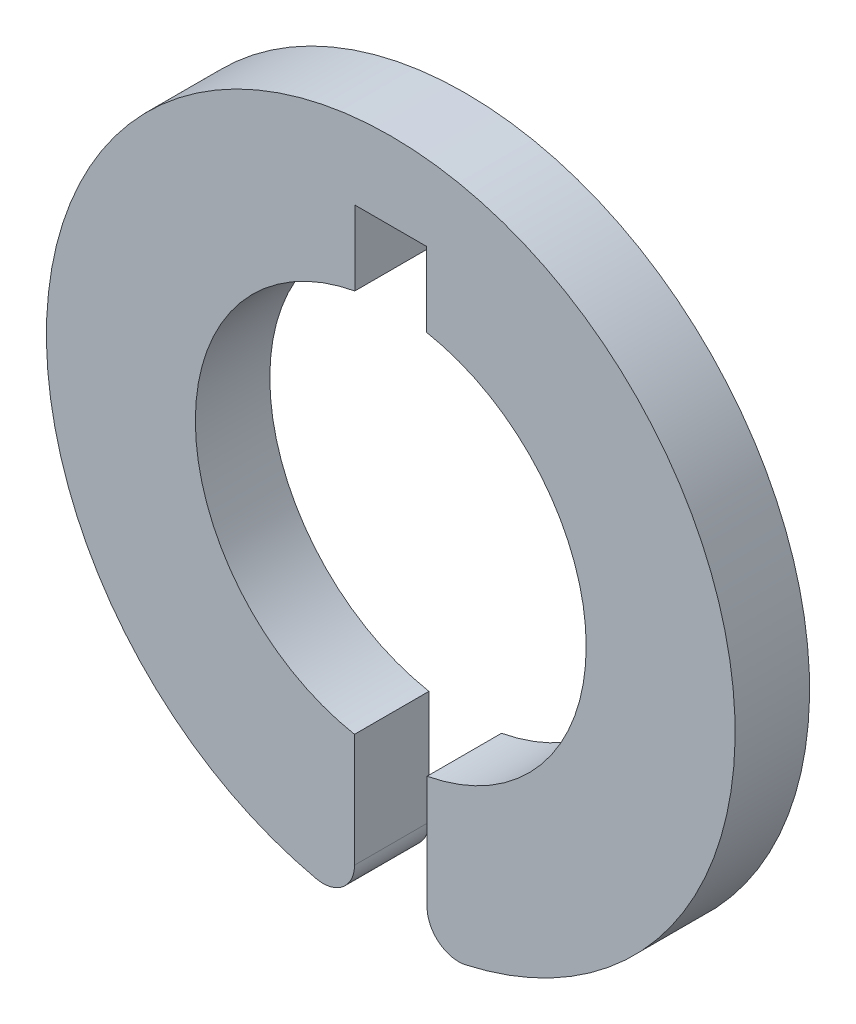
ISO-10303-21;
HEADER;
FILE_DESCRIPTION(('STEP AP214'),'2;1');
FILE_NAME('part.step','',(''),(''),'','','');
FILE_SCHEMA(('AUTOMOTIVE_DESIGN { 1 0 10303 214 1 1 1 1 }'));
ENDSEC;
DATA;
#1=APPLICATION_CONTEXT('core data for automotive mechanical design processes');
#2=APPLICATION_PROTOCOL_DEFINITION('international standard','automotive_design',2000,#1);
#3=PRODUCT_CONTEXT('',#1,'mechanical');
#4=PRODUCT('Part','Part','',(#3));
#5=PRODUCT_RELATED_PRODUCT_CATEGORY('part','',(#4));
#6=PRODUCT_DEFINITION_FORMATION('','',#4);
#7=PRODUCT_DEFINITION_CONTEXT('part definition',#1,'design');
#8=PRODUCT_DEFINITION('design','',#6,#7);
#9=PRODUCT_DEFINITION_SHAPE('','',#8);
#10=(LENGTH_UNIT() NAMED_UNIT(*) SI_UNIT(.MILLI.,.METRE.));
#11=(NAMED_UNIT(*) PLANE_ANGLE_UNIT() SI_UNIT($,.RADIAN.));
#12=(NAMED_UNIT(*) SI_UNIT($,.STERADIAN.) SOLID_ANGLE_UNIT());
#13=UNCERTAINTY_MEASURE_WITH_UNIT(LENGTH_MEASURE(1.E-05),#10,'distance_accuracy_value','');
#14=(GEOMETRIC_REPRESENTATION_CONTEXT(3) GLOBAL_UNCERTAINTY_ASSIGNED_CONTEXT((#13)) GLOBAL_UNIT_ASSIGNED_CONTEXT((#10,
#11,#12)) REPRESENTATION_CONTEXT('',''));
#15=CARTESIAN_POINT('',(0.,0.,0.));
#16=DIRECTION('',(0.,0.,1.));
#17=DIRECTION('',(1.,0.,0.));
#18=AXIS2_PLACEMENT_3D('',#15,#16,#17);
#19=CARTESIAN_POINT('',(0.,0.,3.));
#20=DIRECTION('',(0.,0.,-1.));
#21=DIRECTION('',(-1.,0.,0.));
#22=AXIS2_PLACEMENT_3D('',#19,#20,#21);
#23=CYLINDRICAL_SURFACE('',#22,7.874);
#24=CARTESIAN_POINT('',(0.,0.,0.));
#25=DIRECTION('',(0.,0.,-1.));
#26=DIRECTION('',(1.,0.,0.));
#27=AXIS2_PLACEMENT_3D('',#24,#25,#26);
#28=CIRCLE('',#27,7.874);
#29=CARTESIAN_POINT('',(1.4475,7.73980747499574,0.));
#30=VERTEX_POINT('',#29);
#31=CARTESIAN_POINT('',(1.4625,-7.73698712355139,0.));
#32=VERTEX_POINT('',#31);
#33=EDGE_CURVE('E140',#30,#32,#28,.T.);
#34=ORIENTED_EDGE('',*,*,#33,.T.);
#35=DIRECTION('',(0.,0.,-1.));
#36=VECTOR('',#35,1.);
#37=CARTESIAN_POINT('',(1.4625,-7.73698712355139,3.));
#38=LINE('',#37,#36);
#39=CARTESIAN_POINT('',(1.4625,-7.73698712355139,3.));
#40=VERTEX_POINT('',#39);
#41=EDGE_CURVE('E125',#40,#32,#38,.T.);
#42=ORIENTED_EDGE('',*,*,#41,.F.);
#43=CARTESIAN_POINT('',(0.,0.,3.));
#44=DIRECTION('',(0.,0.,-1.));
#45=DIRECTION('',(1.,0.,0.));
#46=AXIS2_PLACEMENT_3D('',#43,#44,#45);
#47=CIRCLE('',#46,7.874);
#48=CARTESIAN_POINT('',(1.4475,7.73980747499574,3.));
#49=VERTEX_POINT('',#48);
#50=EDGE_CURVE('E130',#49,#40,#47,.T.);
#51=ORIENTED_EDGE('',*,*,#50,.F.);
#52=DIRECTION('',(0.,0.,-1.));
#53=VECTOR('',#52,1.);
#54=CARTESIAN_POINT('',(1.4475,7.73980747499574,3.));
#55=LINE('',#54,#53);
#56=EDGE_CURVE('E185',#49,#30,#55,.T.);
#57=ORIENTED_EDGE('',*,*,#56,.T.);
#58=EDGE_LOOP('',(#34,#42,#51,#57));
#59=FACE_BOUND('',#58,.T.);
#60=ADVANCED_FACE('F45',(#59),#23,.F.);
#61=CARTESIAN_POINT('',(1.4625,-13.7967014083077,3.));
#62=DIRECTION('',(1.,0.,0.));
#63=DIRECTION('',(0.,0.,-1.));
#64=AXIS2_PLACEMENT_3D('',#61,#62,#63);
#65=PLANE('',#64);
#66=DIRECTION('',(0.,-1.,0.));
#67=VECTOR('',#66,1.);
#68=CARTESIAN_POINT('',(1.4625,-13.7967014083077,0.));
#69=LINE('',#68,#67);
#70=CARTESIAN_POINT('',(1.4625,-12.3042374712942,0.));
#71=VERTEX_POINT('',#70);
#72=EDGE_CURVE('E184',#32,#71,#69,.T.);
#73=ORIENTED_EDGE('',*,*,#72,.T.);
#74=DIRECTION('',(0.,0.,-1.));
#75=VECTOR('',#74,1.);
#76=CARTESIAN_POINT('',(1.4625,-12.3042374712942,3.));
#77=LINE('',#76,#75);
#78=CARTESIAN_POINT('',(1.4625,-12.3042374712942,3.));
#79=VERTEX_POINT('',#78);
#80=EDGE_CURVE('E62',#71,#79,#77,.F.);
#81=ORIENTED_EDGE('',*,*,#80,.T.);
#82=DIRECTION('',(0.,-1.,0.));
#83=VECTOR('',#82,1.);
#84=CARTESIAN_POINT('',(1.4625,-13.7967014083077,3.));
#85=LINE('',#84,#83);
#86=EDGE_CURVE('E118',#40,#79,#85,.T.);
#87=ORIENTED_EDGE('',*,*,#86,.F.);
#88=ORIENTED_EDGE('',*,*,#41,.T.);
#89=EDGE_LOOP('',(#73,#81,#87,#88));
#90=FACE_BOUND('',#89,.T.);
#91=ADVANCED_FACE('F124',(#90),#65,.F.);
#92=CARTESIAN_POINT('',(0.,0.,3.));
#93=DIRECTION('',(0.,0.,-1.));
#94=DIRECTION('',(-1.,0.,0.));
#95=AXIS2_PLACEMENT_3D('',#92,#93,#94);
#96=CYLINDRICAL_SURFACE('',#95,13.874);
#97=CARTESIAN_POINT('',(0.,0.,3.));
#98=DIRECTION('',(0.,0.,1.));
#99=DIRECTION('',(-1.,0.,0.));
#100=AXIS2_PLACEMENT_3D('',#97,#98,#99);
#101=CIRCLE('',#100,13.874);
#102=CARTESIAN_POINT('',(3.00783124404951,-13.5440329004075,3.));
#103=VERTEX_POINT('',#102);
#104=CARTESIAN_POINT('',(-3.00783124404951,-13.5440329004075,3.));
#105=VERTEX_POINT('',#104);
#106=EDGE_CURVE('E127',#103,#105,#101,.T.);
#107=ORIENTED_EDGE('',*,*,#106,.F.);
#108=DIRECTION('',(0.,0.,-1.));
#109=VECTOR('',#108,1.);
#110=CARTESIAN_POINT('',(3.00783124404951,-13.5440329004075,3.));
#111=LINE('',#110,#109);
#112=CARTESIAN_POINT('',(3.00783124404951,-13.5440329004075,0.));
#113=VERTEX_POINT('',#112);
#114=EDGE_CURVE('E142',#103,#113,#111,.T.);
#115=ORIENTED_EDGE('',*,*,#114,.T.);
#116=CARTESIAN_POINT('',(0.,0.,0.));
#117=DIRECTION('',(0.,0.,1.));
#118=DIRECTION('',(-1.,0.,0.));
#119=AXIS2_PLACEMENT_3D('',#116,#117,#118);
#120=CIRCLE('',#119,13.874);
#121=CARTESIAN_POINT('',(-3.00783124404951,-13.5440329004075,0.));
#122=VERTEX_POINT('',#121);
#123=EDGE_CURVE('E189',#113,#122,#120,.T.);
#124=ORIENTED_EDGE('',*,*,#123,.T.);
#125=DIRECTION('',(0.,0.,-1.));
#126=VECTOR('',#125,1.);
#127=CARTESIAN_POINT('',(-3.00783124404951,-13.5440329004075,3.));
#128=LINE('',#127,#126);
#129=EDGE_CURVE('E138',#122,#105,#128,.F.);
#130=ORIENTED_EDGE('',*,*,#129,.T.);
#131=EDGE_LOOP('',(#107,#115,#124,#130));
#132=FACE_BOUND('',#131,.T.);
#133=ADVANCED_FACE('F234',(#132),#96,.T.);
#134=CARTESIAN_POINT('',(-1.4625,-13.7967014083077,3.));
#135=DIRECTION('',(-1.,0.,0.));
#136=DIRECTION('',(0.,0.,1.));
#137=AXIS2_PLACEMENT_3D('',#134,#135,#136);
#138=PLANE('',#137);
#139=DIRECTION('',(0.,1.,0.));
#140=VECTOR('',#139,1.);
#141=CARTESIAN_POINT('',(-1.4625,-13.7967014083077,3.));
#142=LINE('',#141,#140);
#143=CARTESIAN_POINT('',(-1.4625,-12.3042374712942,3.));
#144=VERTEX_POINT('',#143);
#145=CARTESIAN_POINT('',(-1.4625,-7.73698712355139,3.));
#146=VERTEX_POINT('',#145);
#147=EDGE_CURVE('E170',#144,#146,#142,.T.);
#148=ORIENTED_EDGE('',*,*,#147,.F.);
#149=DIRECTION('',(0.,0.,-1.));
#150=VECTOR('',#149,1.);
#151=CARTESIAN_POINT('',(-1.4625,-12.3042374712942,3.));
#152=LINE('',#151,#150);
#153=CARTESIAN_POINT('',(-1.4625,-12.3042374712942,0.));
#154=VERTEX_POINT('',#153);
#155=EDGE_CURVE('E12',#144,#154,#152,.T.);
#156=ORIENTED_EDGE('',*,*,#155,.T.);
#157=DIRECTION('',(0.,1.,0.));
#158=VECTOR('',#157,1.);
#159=CARTESIAN_POINT('',(-1.4625,-13.7967014083077,0.));
#160=LINE('',#159,#158);
#161=CARTESIAN_POINT('',(-1.4625,-7.73698712355139,0.));
#162=VERTEX_POINT('',#161);
#163=EDGE_CURVE('E188',#154,#162,#160,.T.);
#164=ORIENTED_EDGE('',*,*,#163,.T.);
#165=DIRECTION('',(0.,0.,-1.));
#166=VECTOR('',#165,1.);
#167=CARTESIAN_POINT('',(-1.4625,-7.73698712355139,3.));
#168=LINE('',#167,#166);
#169=EDGE_CURVE('E137',#146,#162,#168,.T.);
#170=ORIENTED_EDGE('',*,*,#169,.F.);
#171=EDGE_LOOP('',(#148,#156,#164,#170));
#172=FACE_BOUND('',#171,.T.);
#173=ADVANCED_FACE('F237',(#172),#138,.F.);
#174=CARTESIAN_POINT('',(0.,0.,3.));
#175=DIRECTION('',(0.,0.,-1.));
#176=DIRECTION('',(-1.,0.,0.));
#177=AXIS2_PLACEMENT_3D('',#174,#175,#176);
#178=CYLINDRICAL_SURFACE('',#177,7.874);
#179=CARTESIAN_POINT('',(0.,0.,0.));
#180=DIRECTION('',(0.,0.,-1.));
#181=DIRECTION('',(1.,0.,0.));
#182=AXIS2_PLACEMENT_3D('',#179,#180,#181);
#183=CIRCLE('',#182,7.874);
#184=CARTESIAN_POINT('',(-1.4475,7.73980747499574,0.));
#185=VERTEX_POINT('',#184);
#186=EDGE_CURVE('E194',#162,#185,#183,.T.);
#187=ORIENTED_EDGE('',*,*,#186,.T.);
#188=DIRECTION('',(0.,0.,-1.));
#189=VECTOR('',#188,1.);
#190=CARTESIAN_POINT('',(-1.4475,7.73980747499574,3.));
#191=LINE('',#190,#189);
#192=CARTESIAN_POINT('',(-1.4475,7.73980747499574,3.));
#193=VERTEX_POINT('',#192);
#194=EDGE_CURVE('E144',#193,#185,#191,.T.);
#195=ORIENTED_EDGE('',*,*,#194,.F.);
#196=CARTESIAN_POINT('',(0.,0.,3.));
#197=DIRECTION('',(0.,0.,-1.));
#198=DIRECTION('',(1.,0.,0.));
#199=AXIS2_PLACEMENT_3D('',#196,#197,#198);
#200=CIRCLE('',#199,7.874);
#201=EDGE_CURVE('E166',#146,#193,#200,.T.);
#202=ORIENTED_EDGE('',*,*,#201,.F.);
#203=ORIENTED_EDGE('',*,*,#169,.T.);
#204=EDGE_LOOP('',(#187,#195,#202,#203));
#205=FACE_BOUND('',#204,.T.);
#206=ADVANCED_FACE('F236',(#205),#178,.F.);
#207=CARTESIAN_POINT('',(-1.4475,10.7398074749957,3.));
#208=DIRECTION('',(-1.,0.,0.));
#209=DIRECTION('',(0.,-1.,0.));
#210=AXIS2_PLACEMENT_3D('',#207,#208,#209);
#211=PLANE('',#210);
#212=DIRECTION('',(0.,1.,0.));
#213=VECTOR('',#212,1.);
#214=CARTESIAN_POINT('',(-1.4475,10.7398074749957,0.));
#215=LINE('',#214,#213);
#216=CARTESIAN_POINT('',(-1.4475,10.7398074749957,0.));
#217=VERTEX_POINT('',#216);
#218=EDGE_CURVE('E195',#185,#217,#215,.T.);
#219=ORIENTED_EDGE('',*,*,#218,.T.);
#220=DIRECTION('',(0.,0.,-1.));
#221=VECTOR('',#220,1.);
#222=CARTESIAN_POINT('',(-1.4475,10.7398074749957,3.));
#223=LINE('',#222,#221);
#224=CARTESIAN_POINT('',(-1.4475,10.7398074749957,3.));
#225=VERTEX_POINT('',#224);
#226=EDGE_CURVE('E205',#225,#217,#223,.T.);
#227=ORIENTED_EDGE('',*,*,#226,.F.);
#228=DIRECTION('',(0.,1.,0.));
#229=VECTOR('',#228,1.);
#230=CARTESIAN_POINT('',(-1.4475,10.7398074749957,3.));
#231=LINE('',#230,#229);
#232=EDGE_CURVE('E175',#193,#225,#231,.T.);
#233=ORIENTED_EDGE('',*,*,#232,.F.);
#234=ORIENTED_EDGE('',*,*,#194,.T.);
#235=EDGE_LOOP('',(#219,#227,#233,#234));
#236=FACE_BOUND('',#235,.T.);
#237=ADVANCED_FACE('F207',(#236),#211,.F.);
#238=CARTESIAN_POINT('',(-1.4475,10.7398074749957,3.));
#239=DIRECTION('',(0.,1.,0.));
#240=DIRECTION('',(-1.,0.,0.));
#241=AXIS2_PLACEMENT_3D('',#238,#239,#240);
#242=PLANE('',#241);
#243=DIRECTION('',(1.,0.,0.));
#244=VECTOR('',#243,1.);
#245=CARTESIAN_POINT('',(-1.4475,10.7398074749957,0.));
#246=LINE('',#245,#244);
#247=CARTESIAN_POINT('',(1.4475,10.7398074749957,0.));
#248=VERTEX_POINT('',#247);
#249=EDGE_CURVE('E192',#217,#248,#246,.T.);
#250=ORIENTED_EDGE('',*,*,#249,.T.);
#251=DIRECTION('',(0.,0.,-1.));
#252=VECTOR('',#251,1.);
#253=CARTESIAN_POINT('',(1.4475,10.7398074749957,3.));
#254=LINE('',#253,#252);
#255=CARTESIAN_POINT('',(1.4475,10.7398074749957,3.));
#256=VERTEX_POINT('',#255);
#257=EDGE_CURVE('E200',#256,#248,#254,.T.);
#258=ORIENTED_EDGE('',*,*,#257,.F.);
#259=DIRECTION('',(1.,0.,0.));
#260=VECTOR('',#259,1.);
#261=CARTESIAN_POINT('',(-1.4475,10.7398074749957,3.));
#262=LINE('',#261,#260);
#263=EDGE_CURVE('E179',#225,#256,#262,.T.);
#264=ORIENTED_EDGE('',*,*,#263,.F.);
#265=ORIENTED_EDGE('',*,*,#226,.T.);
#266=EDGE_LOOP('',(#250,#258,#264,#265));
#267=FACE_BOUND('',#266,.T.);
#268=ADVANCED_FACE('F225',(#267),#242,.F.);
#269=CARTESIAN_POINT('',(1.4475,10.7398074749957,3.));
#270=DIRECTION('',(1.,0.,0.));
#271=DIRECTION('',(0.,1.,0.));
#272=AXIS2_PLACEMENT_3D('',#269,#270,#271);
#273=PLANE('',#272);
#274=DIRECTION('',(0.,-1.,0.));
#275=VECTOR('',#274,1.);
#276=CARTESIAN_POINT('',(1.4475,10.7398074749957,0.));
#277=LINE('',#276,#275);
#278=EDGE_CURVE('E139',#248,#30,#277,.T.);
#279=ORIENTED_EDGE('',*,*,#278,.T.);
#280=ORIENTED_EDGE('',*,*,#56,.F.);
#281=DIRECTION('',(0.,-1.,0.));
#282=VECTOR('',#281,1.);
#283=CARTESIAN_POINT('',(1.4475,10.7398074749957,3.));
#284=LINE('',#283,#282);
#285=EDGE_CURVE('E131',#256,#49,#284,.T.);
#286=ORIENTED_EDGE('',*,*,#285,.F.);
#287=ORIENTED_EDGE('',*,*,#257,.T.);
#288=EDGE_LOOP('',(#279,#280,#286,#287));
#289=FACE_BOUND('',#288,.T.);
#290=ADVANCED_FACE('F223',(#289),#273,.F.);
#291=CARTESIAN_POINT('',(0.,0.,3.));
#292=DIRECTION('',(0.,0.,1.));
#293=DIRECTION('',(1.,0.,0.));
#294=AXIS2_PLACEMENT_3D('',#291,#292,#293);
#295=PLANE('',#294);
#296=ORIENTED_EDGE('',*,*,#86,.T.);
#297=CARTESIAN_POINT('',(2.7325,-12.3042374712942,3.));
#298=DIRECTION('',(0.,0.,1.));
#299=DIRECTION('',(1.,0.,0.));
#300=AXIS2_PLACEMENT_3D('',#297,#298,#299);
#301=CIRCLE('',#300,1.27);
#302=EDGE_CURVE('E49',#79,#103,#301,.T.);
#303=ORIENTED_EDGE('',*,*,#302,.T.);
#304=ORIENTED_EDGE('',*,*,#106,.T.);
#305=CARTESIAN_POINT('',(-2.7325,-12.3042374712942,3.));
#306=DIRECTION('',(0.,0.,1.));
#307=DIRECTION('',(1.,0.,0.));
#308=AXIS2_PLACEMENT_3D('',#305,#306,#307);
#309=CIRCLE('',#308,1.27);
#310=EDGE_CURVE('E60',#105,#144,#309,.T.);
#311=ORIENTED_EDGE('',*,*,#310,.T.);
#312=ORIENTED_EDGE('',*,*,#147,.T.);
#313=ORIENTED_EDGE('',*,*,#201,.T.);
#314=ORIENTED_EDGE('',*,*,#232,.T.);
#315=ORIENTED_EDGE('',*,*,#263,.T.);
#316=ORIENTED_EDGE('',*,*,#285,.T.);
#317=ORIENTED_EDGE('',*,*,#50,.T.);
#318=EDGE_LOOP('',(#296,#303,#304,#311,#312,#313,#314,#315,#316,#317));
#319=FACE_BOUND('',#318,.T.);
#320=ADVANCED_FACE('F128',(#319),#295,.T.);
#321=CARTESIAN_POINT('',(0.,0.,0.));
#322=DIRECTION('',(0.,0.,1.));
#323=DIRECTION('',(1.,0.,0.));
#324=AXIS2_PLACEMENT_3D('',#321,#322,#323);
#325=PLANE('',#324);
#326=ORIENTED_EDGE('',*,*,#123,.F.);
#327=CARTESIAN_POINT('',(2.7325,-12.3042374712942,0.));
#328=DIRECTION('',(0.,0.,1.));
#329=DIRECTION('',(1.,0.,0.));
#330=AXIS2_PLACEMENT_3D('',#327,#328,#329);
#331=CIRCLE('',#330,1.27);
#332=EDGE_CURVE('E153',#113,#71,#331,.F.);
#333=ORIENTED_EDGE('',*,*,#332,.T.);
#334=ORIENTED_EDGE('',*,*,#72,.F.);
#335=ORIENTED_EDGE('',*,*,#33,.F.);
#336=ORIENTED_EDGE('',*,*,#278,.F.);
#337=ORIENTED_EDGE('',*,*,#249,.F.);
#338=ORIENTED_EDGE('',*,*,#218,.F.);
#339=ORIENTED_EDGE('',*,*,#186,.F.);
#340=ORIENTED_EDGE('',*,*,#163,.F.);
#341=CARTESIAN_POINT('',(-2.7325,-12.3042374712942,0.));
#342=DIRECTION('',(0.,0.,1.));
#343=DIRECTION('',(1.,0.,0.));
#344=AXIS2_PLACEMENT_3D('',#341,#342,#343);
#345=CIRCLE('',#344,1.27);
#346=EDGE_CURVE('E151',#154,#122,#345,.F.);
#347=ORIENTED_EDGE('',*,*,#346,.T.);
#348=EDGE_LOOP('',(#326,#333,#334,#335,#336,#337,#338,#339,#340,#347));
#349=FACE_BOUND('',#348,.T.);
#350=ADVANCED_FACE('F220',(#349),#325,.F.);
#351=CARTESIAN_POINT('',(2.7325,-12.3042374712942,3.));
#352=DIRECTION('',(0.,0.,-1.));
#353=DIRECTION('',(-1.,0.,0.));
#354=AXIS2_PLACEMENT_3D('',#351,#352,#353);
#355=CYLINDRICAL_SURFACE('',#354,1.27);
#356=ORIENTED_EDGE('',*,*,#302,.F.);
#357=ORIENTED_EDGE('',*,*,#80,.F.);
#358=ORIENTED_EDGE('',*,*,#332,.F.);
#359=ORIENTED_EDGE('',*,*,#114,.F.);
#360=EDGE_LOOP('',(#356,#357,#358,#359));
#361=FACE_BOUND('',#360,.T.);
#362=ADVANCED_FACE('F226',(#361),#355,.T.);
#363=CARTESIAN_POINT('',(-2.7325,-12.3042374712942,3.));
#364=DIRECTION('',(0.,0.,-1.));
#365=DIRECTION('',(-1.,0.,0.));
#366=AXIS2_PLACEMENT_3D('',#363,#364,#365);
#367=CYLINDRICAL_SURFACE('',#366,1.27);
#368=ORIENTED_EDGE('',*,*,#310,.F.);
#369=ORIENTED_EDGE('',*,*,#129,.F.);
#370=ORIENTED_EDGE('',*,*,#346,.F.);
#371=ORIENTED_EDGE('',*,*,#155,.F.);
#372=EDGE_LOOP('',(#368,#369,#370,#371));
#373=FACE_BOUND('',#372,.T.);
#374=ADVANCED_FACE('F42',(#373),#367,.T.);
#375=CLOSED_SHELL('',(#60,#91,#133,#173,#206,#237,#268,#290,#320,#350,#362,#374));
#376=MANIFOLD_SOLID_BREP('B2',#375);
#377=ADVANCED_BREP_SHAPE_REPRESENTATION('',(#18,#376),#14);
#378=SHAPE_DEFINITION_REPRESENTATION(#9,#377);
ENDSEC;
END-ISO-10303-21;
